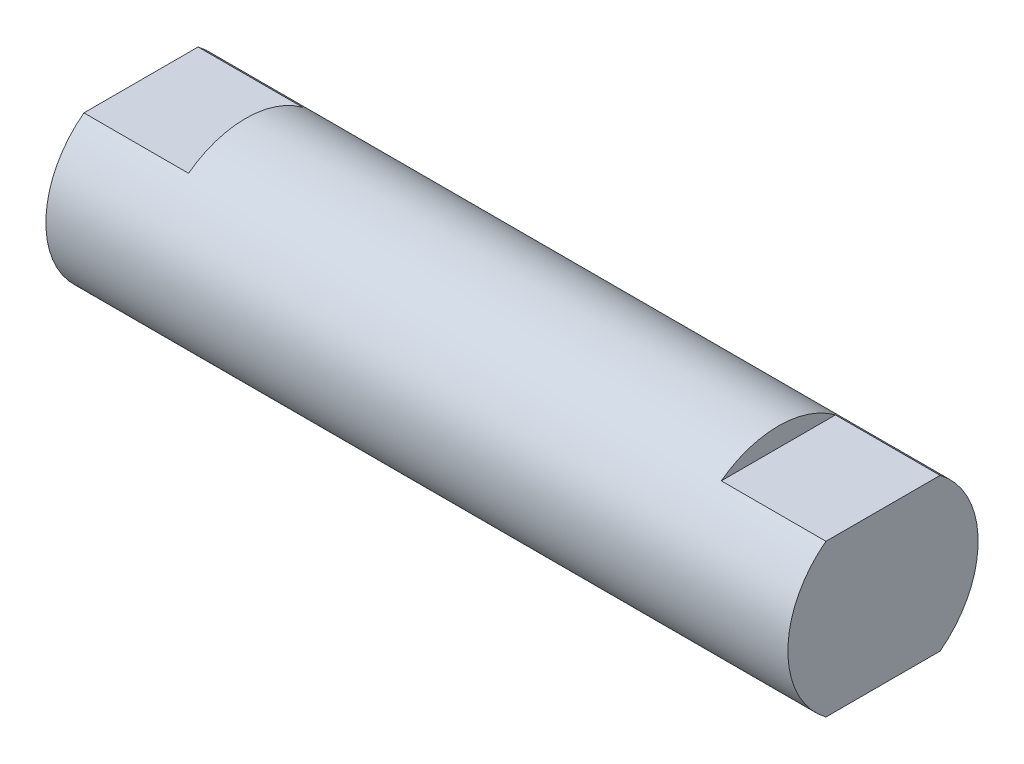
ISO-10303-21;
HEADER;
FILE_DESCRIPTION(('STEP AP214'),'2;1');
FILE_NAME('part.step','',(''),(''),'','','');
FILE_SCHEMA(('AUTOMOTIVE_DESIGN { 1 0 10303 214 1 1 1 1 }'));
ENDSEC;
DATA;
#1=APPLICATION_CONTEXT('core data for automotive mechanical design processes');
#2=APPLICATION_PROTOCOL_DEFINITION('international standard','automotive_design',2000,#1);
#3=PRODUCT_CONTEXT('',#1,'mechanical');
#4=PRODUCT('Part','Part','',(#3));
#5=PRODUCT_RELATED_PRODUCT_CATEGORY('part','',(#4));
#6=PRODUCT_DEFINITION_FORMATION('','',#4);
#7=PRODUCT_DEFINITION_CONTEXT('part definition',#1,'design');
#8=PRODUCT_DEFINITION('design','',#6,#7);
#9=PRODUCT_DEFINITION_SHAPE('','',#8);
#10=(LENGTH_UNIT() NAMED_UNIT(*) SI_UNIT(.MILLI.,.METRE.));
#11=(NAMED_UNIT(*) PLANE_ANGLE_UNIT() SI_UNIT($,.RADIAN.));
#12=(NAMED_UNIT(*) SI_UNIT($,.STERADIAN.) SOLID_ANGLE_UNIT());
#13=UNCERTAINTY_MEASURE_WITH_UNIT(LENGTH_MEASURE(1.E-05),#10,'distance_accuracy_value','');
#14=(GEOMETRIC_REPRESENTATION_CONTEXT(3) GLOBAL_UNCERTAINTY_ASSIGNED_CONTEXT((#13)) GLOBAL_UNIT_ASSIGNED_CONTEXT((#10,
#11,#12)) REPRESENTATION_CONTEXT('',''));
#15=CARTESIAN_POINT('',(0.,0.,0.));
#16=DIRECTION('',(0.,0.,1.));
#17=DIRECTION('',(1.,0.,0.));
#18=AXIS2_PLACEMENT_3D('',#15,#16,#17);
#19=CARTESIAN_POINT('',(-9.75,0.,0.));
#20=DIRECTION('',(1.,0.,0.));
#21=DIRECTION('',(0.,0.,-1.));
#22=AXIS2_PLACEMENT_3D('',#19,#20,#21);
#23=CYLINDRICAL_SURFACE('',#22,2.5);
#24=DIRECTION('',(-1.,0.,0.));
#25=VECTOR('',#24,1.);
#26=CARTESIAN_POINT('',(-7.0000000005,-2.00000000020795,1.49999999972273));
#27=LINE('',#26,#25);
#28=CARTESIAN_POINT('',(-7.0000000005,-2.00000000020795,1.49999999972273));
#29=VERTEX_POINT('',#28);
#30=CARTESIAN_POINT('',(-9.75,-2.00000000020795,1.49999999972273));
#31=VERTEX_POINT('',#30);
#32=EDGE_CURVE('E132',#29,#31,#27,.T.);
#33=ORIENTED_EDGE('',*,*,#32,.F.);
#34=CARTESIAN_POINT('',(-7.0000000005,0.,0.));
#35=DIRECTION('',(-1.,0.,0.));
#36=DIRECTION('',(0.,0.,1.));
#37=AXIS2_PLACEMENT_3D('',#34,#35,#36);
#38=CIRCLE('',#37,2.5);
#39=CARTESIAN_POINT('',(-7.0000000005,-2.00000000020795,-1.49999999972273));
#40=VERTEX_POINT('',#39);
#41=EDGE_CURVE('E127',#40,#29,#38,.T.);
#42=ORIENTED_EDGE('',*,*,#41,.F.);
#43=DIRECTION('',(-1.,0.,0.));
#44=VECTOR('',#43,1.);
#45=CARTESIAN_POINT('',(-7.0000000005,-2.00000000020795,-1.49999999972273));
#46=LINE('',#45,#44);
#47=CARTESIAN_POINT('',(-9.75,-2.00000000020795,-1.49999999972273));
#48=VERTEX_POINT('',#47);
#49=EDGE_CURVE('E134',#40,#48,#46,.T.);
#50=ORIENTED_EDGE('',*,*,#49,.T.);
#51=CARTESIAN_POINT('',(-9.75,0.,0.));
#52=DIRECTION('',(1.,0.,0.));
#53=DIRECTION('',(0.,0.,1.));
#54=AXIS2_PLACEMENT_3D('',#51,#52,#53);
#55=CIRCLE('',#54,2.5);
#56=CARTESIAN_POINT('',(-9.75,2.00000000020795,-1.49999999972273));
#57=VERTEX_POINT('',#56);
#58=EDGE_CURVE('E40',#48,#57,#55,.T.);
#59=ORIENTED_EDGE('',*,*,#58,.T.);
#60=DIRECTION('',(-1.,0.,0.));
#61=VECTOR('',#60,1.);
#62=CARTESIAN_POINT('',(-7.0000000005,2.00000000020795,-1.49999999972273));
#63=LINE('',#62,#61);
#64=CARTESIAN_POINT('',(-7.0000000005,2.00000000020795,-1.49999999972273));
#65=VERTEX_POINT('',#64);
#66=EDGE_CURVE('E144',#65,#57,#63,.T.);
#67=ORIENTED_EDGE('',*,*,#66,.F.);
#68=CARTESIAN_POINT('',(-7.0000000005,0.,0.));
#69=DIRECTION('',(-1.,0.,0.));
#70=DIRECTION('',(0.,0.,1.));
#71=AXIS2_PLACEMENT_3D('',#68,#69,#70);
#72=CIRCLE('',#71,2.5);
#73=CARTESIAN_POINT('',(-7.0000000005,2.00000000020795,1.49999999972273));
#74=VERTEX_POINT('',#73);
#75=EDGE_CURVE('E139',#74,#65,#72,.T.);
#76=ORIENTED_EDGE('',*,*,#75,.F.);
#77=DIRECTION('',(-1.,0.,0.));
#78=VECTOR('',#77,1.);
#79=CARTESIAN_POINT('',(-7.0000000005,2.00000000020795,1.49999999972273));
#80=LINE('',#79,#78);
#81=CARTESIAN_POINT('',(-9.75,2.00000000020795,1.49999999972273));
#82=VERTEX_POINT('',#81);
#83=EDGE_CURVE('E146',#74,#82,#80,.T.);
#84=ORIENTED_EDGE('',*,*,#83,.T.);
#85=EDGE_CURVE('E11',#82,#31,#55,.T.);
#86=ORIENTED_EDGE('',*,*,#85,.T.);
#87=EDGE_LOOP('',(#33,#42,#50,#59,#67,#76,#84,#86));
#88=FACE_BOUND('',#87,.T.);
#89=CARTESIAN_POINT('',(9.75,0.,0.));
#90=DIRECTION('',(1.,0.,0.));
#91=DIRECTION('',(0.,0.,1.));
#92=AXIS2_PLACEMENT_3D('',#89,#90,#91);
#93=CIRCLE('',#92,2.5);
#94=CARTESIAN_POINT('',(9.75,-2.00000000020795,-1.49999999972273));
#95=VERTEX_POINT('',#94);
#96=CARTESIAN_POINT('',(9.75,2.00000000020795,-1.49999999972273));
#97=VERTEX_POINT('',#96);
#98=EDGE_CURVE('E111',#95,#97,#93,.T.);
#99=ORIENTED_EDGE('',*,*,#98,.F.);
#100=DIRECTION('',(1.,0.,0.));
#101=VECTOR('',#100,1.);
#102=CARTESIAN_POINT('',(7.0000000005,-2.00000000020795,-1.49999999972273));
#103=LINE('',#102,#101);
#104=CARTESIAN_POINT('',(7.0000000005,-2.00000000020795,-1.49999999972273));
#105=VERTEX_POINT('',#104);
#106=EDGE_CURVE('E47',#105,#95,#103,.T.);
#107=ORIENTED_EDGE('',*,*,#106,.F.);
#108=CARTESIAN_POINT('',(7.0000000005,0.,0.));
#109=DIRECTION('',(-1.,0.,0.));
#110=DIRECTION('',(0.,0.,1.));
#111=AXIS2_PLACEMENT_3D('',#108,#109,#110);
#112=CIRCLE('',#111,2.5);
#113=CARTESIAN_POINT('',(7.0000000005,-2.00000000020795,1.49999999972273));
#114=VERTEX_POINT('',#113);
#115=EDGE_CURVE('E103',#105,#114,#112,.T.);
#116=ORIENTED_EDGE('',*,*,#115,.T.);
#117=DIRECTION('',(1.,0.,0.));
#118=VECTOR('',#117,1.);
#119=CARTESIAN_POINT('',(7.0000000005,-2.00000000020795,1.49999999972273));
#120=LINE('',#119,#118);
#121=CARTESIAN_POINT('',(9.75,-2.00000000020795,1.49999999972273));
#122=VERTEX_POINT('',#121);
#123=EDGE_CURVE('E100',#114,#122,#120,.T.);
#124=ORIENTED_EDGE('',*,*,#123,.T.);
#125=CARTESIAN_POINT('',(9.75,2.00000000020795,1.49999999972273));
#126=VERTEX_POINT('',#125);
#127=EDGE_CURVE('E35',#126,#122,#93,.T.);
#128=ORIENTED_EDGE('',*,*,#127,.F.);
#129=DIRECTION('',(1.,0.,0.));
#130=VECTOR('',#129,1.);
#131=CARTESIAN_POINT('',(7.0000000005,2.00000000020795,1.49999999972273));
#132=LINE('',#131,#130);
#133=CARTESIAN_POINT('',(7.0000000005,2.00000000020795,1.49999999972273));
#134=VERTEX_POINT('',#133);
#135=EDGE_CURVE('E55',#134,#126,#132,.T.);
#136=ORIENTED_EDGE('',*,*,#135,.F.);
#137=CARTESIAN_POINT('',(7.0000000005,0.,0.));
#138=DIRECTION('',(-1.,0.,0.));
#139=DIRECTION('',(0.,0.,1.));
#140=AXIS2_PLACEMENT_3D('',#137,#138,#139);
#141=CIRCLE('',#140,2.5);
#142=CARTESIAN_POINT('',(7.0000000005,2.00000000020795,-1.49999999972273));
#143=VERTEX_POINT('',#142);
#144=EDGE_CURVE('E117',#134,#143,#141,.T.);
#145=ORIENTED_EDGE('',*,*,#144,.T.);
#146=DIRECTION('',(1.,0.,0.));
#147=VECTOR('',#146,1.);
#148=CARTESIAN_POINT('',(7.0000000005,2.00000000020795,-1.49999999972273));
#149=LINE('',#148,#147);
#150=EDGE_CURVE('E123',#143,#97,#149,.T.);
#151=ORIENTED_EDGE('',*,*,#150,.T.);
#152=EDGE_LOOP('',(#99,#107,#116,#124,#128,#136,#145,#151));
#153=FACE_BOUND('',#152,.T.);
#154=ADVANCED_FACE('F32',(#88,#153),#23,.T.);
#155=CARTESIAN_POINT('',(9.75,0.,0.));
#156=DIRECTION('',(-1.,0.,0.));
#157=DIRECTION('',(0.,0.,1.));
#158=AXIS2_PLACEMENT_3D('',#155,#156,#157);
#159=PLANE('',#158);
#160=DIRECTION('',(0.,0.,-1.));
#161=VECTOR('',#160,1.);
#162=CARTESIAN_POINT('',(9.75,-2.00000000020795,1.49999999972273));
#163=LINE('',#162,#161);
#164=EDGE_CURVE('E107',#122,#95,#163,.T.);
#165=ORIENTED_EDGE('',*,*,#164,.T.);
#166=ORIENTED_EDGE('',*,*,#98,.T.);
#167=DIRECTION('',(0.,0.,1.));
#168=VECTOR('',#167,1.);
#169=CARTESIAN_POINT('',(9.75,2.00000000020795,-1.49999999972273));
#170=LINE('',#169,#168);
#171=EDGE_CURVE('E113',#97,#126,#170,.T.);
#172=ORIENTED_EDGE('',*,*,#171,.T.);
#173=ORIENTED_EDGE('',*,*,#127,.T.);
#174=EDGE_LOOP('',(#165,#166,#172,#173));
#175=FACE_BOUND('',#174,.T.);
#176=ADVANCED_FACE('F178',(#175),#159,.F.);
#177=CARTESIAN_POINT('',(-9.75,0.,0.));
#178=DIRECTION('',(-1.,0.,0.));
#179=DIRECTION('',(0.,0.,1.));
#180=AXIS2_PLACEMENT_3D('',#177,#178,#179);
#181=PLANE('',#180);
#182=DIRECTION('',(0.,0.,-1.));
#183=VECTOR('',#182,1.);
#184=CARTESIAN_POINT('',(-9.75,-2.00000000020795,1.49999999972273));
#185=LINE('',#184,#183);
#186=EDGE_CURVE('E125',#31,#48,#185,.T.);
#187=ORIENTED_EDGE('',*,*,#186,.F.);
#188=ORIENTED_EDGE('',*,*,#85,.F.);
#189=DIRECTION('',(0.,0.,1.));
#190=VECTOR('',#189,1.);
#191=CARTESIAN_POINT('',(-9.75,2.00000000020795,-1.49999999972273));
#192=LINE('',#191,#190);
#193=EDGE_CURVE('E137',#57,#82,#192,.T.);
#194=ORIENTED_EDGE('',*,*,#193,.F.);
#195=ORIENTED_EDGE('',*,*,#58,.F.);
#196=EDGE_LOOP('',(#187,#188,#194,#195));
#197=FACE_BOUND('',#196,.T.);
#198=ADVANCED_FACE('F161',(#197),#181,.T.);
#199=CARTESIAN_POINT('',(-7.0000000005,2.00000000020795,-1.49999999972273));
#200=DIRECTION('',(0.,-1.,0.));
#201=DIRECTION('',(0.,0.,-1.));
#202=AXIS2_PLACEMENT_3D('',#199,#200,#201);
#203=PLANE('',#202);
#204=ORIENTED_EDGE('',*,*,#193,.T.);
#205=ORIENTED_EDGE('',*,*,#83,.F.);
#206=DIRECTION('',(0.,0.,1.));
#207=VECTOR('',#206,1.);
#208=CARTESIAN_POINT('',(-7.0000000005,2.00000000020795,-1.49999999972273));
#209=LINE('',#208,#207);
#210=EDGE_CURVE('E141',#65,#74,#209,.T.);
#211=ORIENTED_EDGE('',*,*,#210,.F.);
#212=ORIENTED_EDGE('',*,*,#66,.T.);
#213=EDGE_LOOP('',(#204,#205,#211,#212));
#214=FACE_BOUND('',#213,.T.);
#215=ADVANCED_FACE('F154',(#214),#203,.F.);
#216=CARTESIAN_POINT('',(-7.0000000005,0.,0.));
#217=DIRECTION('',(-1.,0.,0.));
#218=DIRECTION('',(0.,0.,1.));
#219=AXIS2_PLACEMENT_3D('',#216,#217,#218);
#220=PLANE('',#219);
#221=ORIENTED_EDGE('',*,*,#75,.T.);
#222=ORIENTED_EDGE('',*,*,#210,.T.);
#223=EDGE_LOOP('',(#221,#222));
#224=FACE_BOUND('',#223,.T.);
#225=ADVANCED_FACE('F165',(#224),#220,.T.);
#226=CARTESIAN_POINT('',(-7.0000000005,-2.00000000020795,1.49999999972273));
#227=DIRECTION('',(0.,1.,0.));
#228=DIRECTION('',(0.,0.,1.));
#229=AXIS2_PLACEMENT_3D('',#226,#227,#228);
#230=PLANE('',#229);
#231=ORIENTED_EDGE('',*,*,#186,.T.);
#232=ORIENTED_EDGE('',*,*,#49,.F.);
#233=DIRECTION('',(0.,0.,-1.));
#234=VECTOR('',#233,1.);
#235=CARTESIAN_POINT('',(-7.0000000005,-2.00000000020795,1.49999999972273));
#236=LINE('',#235,#234);
#237=EDGE_CURVE('E129',#29,#40,#236,.T.);
#238=ORIENTED_EDGE('',*,*,#237,.F.);
#239=ORIENTED_EDGE('',*,*,#32,.T.);
#240=EDGE_LOOP('',(#231,#232,#238,#239));
#241=FACE_BOUND('',#240,.T.);
#242=ADVANCED_FACE('F167',(#241),#230,.F.);
#243=CARTESIAN_POINT('',(-7.0000000005,0.,0.));
#244=DIRECTION('',(-1.,0.,0.));
#245=DIRECTION('',(0.,0.,1.));
#246=AXIS2_PLACEMENT_3D('',#243,#244,#245);
#247=PLANE('',#246);
#248=ORIENTED_EDGE('',*,*,#41,.T.);
#249=ORIENTED_EDGE('',*,*,#237,.T.);
#250=EDGE_LOOP('',(#248,#249));
#251=FACE_BOUND('',#250,.T.);
#252=ADVANCED_FACE('F173',(#251),#247,.T.);
#253=CARTESIAN_POINT('',(7.0000000005,2.00000000020795,-1.49999999972273));
#254=DIRECTION('',(0.,1.,0.));
#255=DIRECTION('',(0.,0.,1.));
#256=AXIS2_PLACEMENT_3D('',#253,#254,#255);
#257=PLANE('',#256);
#258=ORIENTED_EDGE('',*,*,#171,.F.);
#259=ORIENTED_EDGE('',*,*,#150,.F.);
#260=DIRECTION('',(0.,0.,1.));
#261=VECTOR('',#260,1.);
#262=CARTESIAN_POINT('',(7.0000000005,2.00000000020795,-1.49999999972273));
#263=LINE('',#262,#261);
#264=EDGE_CURVE('E120',#143,#134,#263,.T.);
#265=ORIENTED_EDGE('',*,*,#264,.T.);
#266=ORIENTED_EDGE('',*,*,#135,.T.);
#267=EDGE_LOOP('',(#258,#259,#265,#266));
#268=FACE_BOUND('',#267,.T.);
#269=ADVANCED_FACE('F192',(#268),#257,.T.);
#270=CARTESIAN_POINT('',(7.0000000005,0.,0.));
#271=DIRECTION('',(1.,0.,0.));
#272=DIRECTION('',(0.,0.,1.));
#273=AXIS2_PLACEMENT_3D('',#270,#271,#272);
#274=PLANE('',#273);
#275=ORIENTED_EDGE('',*,*,#144,.F.);
#276=ORIENTED_EDGE('',*,*,#264,.F.);
#277=EDGE_LOOP('',(#275,#276));
#278=FACE_BOUND('',#277,.T.);
#279=ADVANCED_FACE('F197',(#278),#274,.T.);
#280=CARTESIAN_POINT('',(7.0000000005,-2.00000000020795,1.49999999972273));
#281=DIRECTION('',(0.,-1.,0.));
#282=DIRECTION('',(0.,0.,-1.));
#283=AXIS2_PLACEMENT_3D('',#280,#281,#282);
#284=PLANE('',#283);
#285=ORIENTED_EDGE('',*,*,#164,.F.);
#286=ORIENTED_EDGE('',*,*,#123,.F.);
#287=DIRECTION('',(0.,0.,-1.));
#288=VECTOR('',#287,1.);
#289=CARTESIAN_POINT('',(7.0000000005,-2.00000000020795,1.49999999972273));
#290=LINE('',#289,#288);
#291=EDGE_CURVE('E96',#114,#105,#290,.T.);
#292=ORIENTED_EDGE('',*,*,#291,.T.);
#293=ORIENTED_EDGE('',*,*,#106,.T.);
#294=EDGE_LOOP('',(#285,#286,#292,#293));
#295=FACE_BOUND('',#294,.T.);
#296=ADVANCED_FACE('F98',(#295),#284,.T.);
#297=CARTESIAN_POINT('',(7.0000000005,0.,0.));
#298=DIRECTION('',(1.,0.,0.));
#299=DIRECTION('',(0.,0.,1.));
#300=AXIS2_PLACEMENT_3D('',#297,#298,#299);
#301=PLANE('',#300);
#302=ORIENTED_EDGE('',*,*,#115,.F.);
#303=ORIENTED_EDGE('',*,*,#291,.F.);
#304=EDGE_LOOP('',(#302,#303));
#305=FACE_BOUND('',#304,.T.);
#306=ADVANCED_FACE('F105',(#305),#301,.T.);
#307=CLOSED_SHELL('',(#154,#176,#198,#215,#225,#242,#252,#269,#279,#296,#306));
#308=MANIFOLD_SOLID_BREP('B2',#307);
#309=ADVANCED_BREP_SHAPE_REPRESENTATION('',(#18,#308),#14);
#310=SHAPE_DEFINITION_REPRESENTATION(#9,#309);
ENDSEC;
END-ISO-10303-21;
